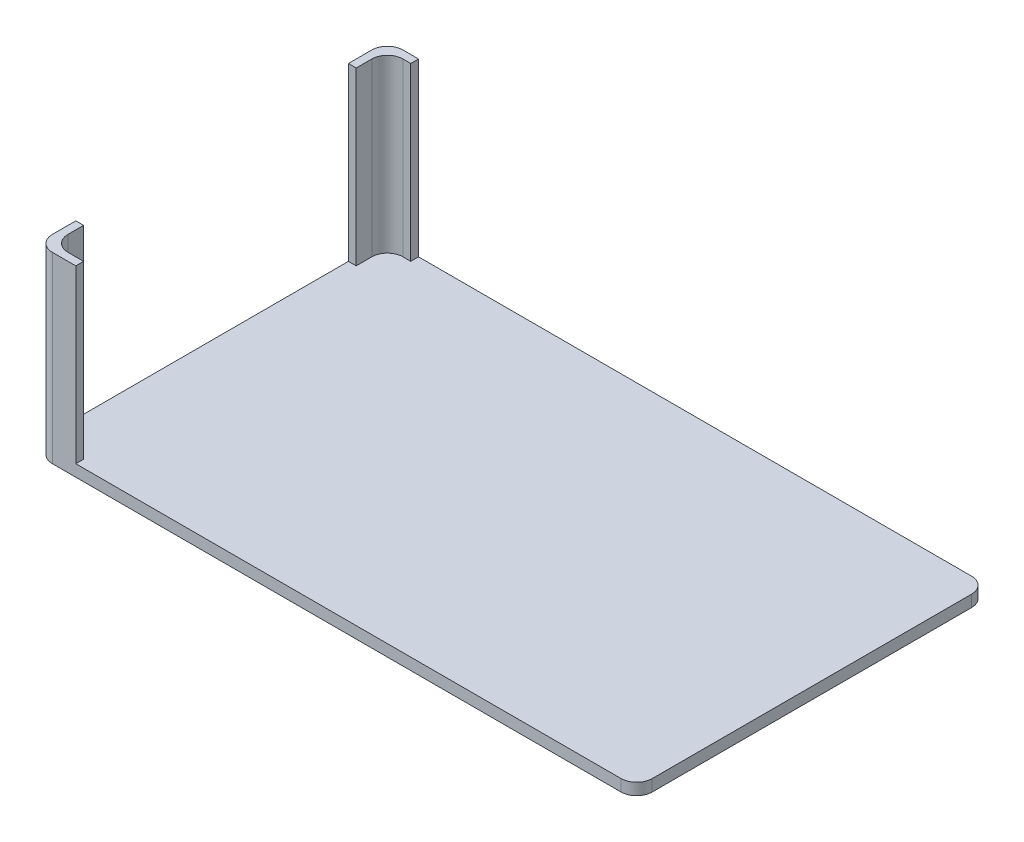
ISO-10303-21;
HEADER;
FILE_DESCRIPTION(('STEP AP214'),'2;1');
FILE_NAME('part.step','',(''),(''),'','','');
FILE_SCHEMA(('AUTOMOTIVE_DESIGN { 1 0 10303 214 1 1 1 1 }'));
ENDSEC;
DATA;
#1=APPLICATION_CONTEXT('core data for automotive mechanical design processes');
#2=APPLICATION_PROTOCOL_DEFINITION('international standard','automotive_design',2000,#1);
#3=PRODUCT_CONTEXT('',#1,'mechanical');
#4=PRODUCT('Part','Part','',(#3));
#5=PRODUCT_RELATED_PRODUCT_CATEGORY('part','',(#4));
#6=PRODUCT_DEFINITION_FORMATION('','',#4);
#7=PRODUCT_DEFINITION_CONTEXT('part definition',#1,'design');
#8=PRODUCT_DEFINITION('design','',#6,#7);
#9=PRODUCT_DEFINITION_SHAPE('','',#8);
#10=(LENGTH_UNIT() NAMED_UNIT(*) SI_UNIT(.MILLI.,.METRE.));
#11=(NAMED_UNIT(*) PLANE_ANGLE_UNIT() SI_UNIT($,.RADIAN.));
#12=(NAMED_UNIT(*) SI_UNIT($,.STERADIAN.) SOLID_ANGLE_UNIT());
#13=UNCERTAINTY_MEASURE_WITH_UNIT(LENGTH_MEASURE(1.E-05),#10,'distance_accuracy_value','');
#14=(GEOMETRIC_REPRESENTATION_CONTEXT(3) GLOBAL_UNCERTAINTY_ASSIGNED_CONTEXT((#13)) GLOBAL_UNIT_ASSIGNED_CONTEXT((#10,
#11,#12)) REPRESENTATION_CONTEXT('',''));
#15=CARTESIAN_POINT('',(0.,0.,0.));
#16=DIRECTION('',(0.,0.,1.));
#17=DIRECTION('',(1.,0.,0.));
#18=AXIS2_PLACEMENT_3D('',#15,#16,#17);
#19=CARTESIAN_POINT('',(-36.,23.5,29.));
#20=DIRECTION('',(0.,0.,-1.));
#21=DIRECTION('',(-1.,0.,0.));
#22=AXIS2_PLACEMENT_3D('',#19,#20,#21);
#23=PLANE('',#22);
#24=DIRECTION('',(0.,-1.,0.));
#25=VECTOR('',#24,1.);
#26=CARTESIAN_POINT('',(37.,23.5,29.));
#27=LINE('',#26,#25);
#28=CARTESIAN_POINT('',(37.,1.5,29.));
#29=VERTEX_POINT('',#28);
#30=CARTESIAN_POINT('',(37.,0.,29.));
#31=VERTEX_POINT('',#30);
#32=EDGE_CURVE('E245',#29,#31,#27,.T.);
#33=ORIENTED_EDGE('',*,*,#32,.F.);
#34=DIRECTION('',(1.,0.,0.));
#35=VECTOR('',#34,1.);
#36=CARTESIAN_POINT('',(0.,1.5,29.));
#37=LINE('',#36,#35);
#38=CARTESIAN_POINT('',(-33.,1.5,29.));
#39=VERTEX_POINT('',#38);
#40=EDGE_CURVE('E376',#39,#29,#37,.T.);
#41=ORIENTED_EDGE('',*,*,#40,.F.);
#42=DIRECTION('',(0.,1.,0.));
#43=VECTOR('',#42,1.);
#44=CARTESIAN_POINT('',(-33.,1.5,29.));
#45=LINE('',#44,#43);
#46=CARTESIAN_POINT('',(-33.,23.5,29.));
#47=VERTEX_POINT('',#46);
#48=EDGE_CURVE('E375',#39,#47,#45,.T.);
#49=ORIENTED_EDGE('',*,*,#48,.T.);
#50=DIRECTION('',(1.,0.,0.));
#51=VECTOR('',#50,1.);
#52=CARTESIAN_POINT('',(-36.,23.5,29.));
#53=LINE('',#52,#51);
#54=CARTESIAN_POINT('',(-36.,23.5,29.));
#55=VERTEX_POINT('',#54);
#56=EDGE_CURVE('E363',#55,#47,#53,.T.);
#57=ORIENTED_EDGE('',*,*,#56,.F.);
#58=DIRECTION('',(0.,-1.,0.));
#59=VECTOR('',#58,1.);
#60=CARTESIAN_POINT('',(-36.,23.5,29.));
#61=LINE('',#60,#59);
#62=CARTESIAN_POINT('',(-36.,0.,29.));
#63=VERTEX_POINT('',#62);
#64=EDGE_CURVE('E292',#55,#63,#61,.T.);
#65=ORIENTED_EDGE('',*,*,#64,.T.);
#66=DIRECTION('',(1.,0.,0.));
#67=VECTOR('',#66,1.);
#68=CARTESIAN_POINT('',(-36.,0.,29.));
#69=LINE('',#68,#67);
#70=EDGE_CURVE('E279',#63,#31,#69,.T.);
#71=ORIENTED_EDGE('',*,*,#70,.T.);
#72=EDGE_LOOP('',(#33,#41,#49,#57,#65,#71));
#73=FACE_BOUND('',#72,.T.);
#74=ADVANCED_FACE('F83',(#73),#23,.F.);
#75=CARTESIAN_POINT('',(39.,23.5,-14.));
#76=DIRECTION('',(1.,0.,0.));
#77=DIRECTION('',(0.,0.,-1.));
#78=AXIS2_PLACEMENT_3D('',#75,#76,#77);
#79=PLANE('',#78);
#80=DIRECTION('',(0.,-1.,0.));
#81=VECTOR('',#80,1.);
#82=CARTESIAN_POINT('',(39.,23.5,-14.));
#83=LINE('',#82,#81);
#84=CARTESIAN_POINT('',(39.,1.5,-14.));
#85=VERTEX_POINT('',#84);
#86=CARTESIAN_POINT('',(39.,0.,-14.));
#87=VERTEX_POINT('',#86);
#88=EDGE_CURVE('E234',#85,#87,#83,.T.);
#89=ORIENTED_EDGE('',*,*,#88,.F.);
#90=DIRECTION('',(0.,0.,-1.));
#91=VECTOR('',#90,1.);
#92=CARTESIAN_POINT('',(39.,1.5,0.));
#93=LINE('',#92,#91);
#94=CARTESIAN_POINT('',(39.,1.5,27.));
#95=VERTEX_POINT('',#94);
#96=EDGE_CURVE('E218',#95,#85,#93,.T.);
#97=ORIENTED_EDGE('',*,*,#96,.F.);
#98=DIRECTION('',(0.,-1.,0.));
#99=VECTOR('',#98,1.);
#100=CARTESIAN_POINT('',(39.,23.5,27.));
#101=LINE('',#100,#99);
#102=CARTESIAN_POINT('',(39.,0.,27.));
#103=VERTEX_POINT('',#102);
#104=EDGE_CURVE('E243',#95,#103,#101,.T.);
#105=ORIENTED_EDGE('',*,*,#104,.T.);
#106=DIRECTION('',(0.,0.,1.));
#107=VECTOR('',#106,1.);
#108=CARTESIAN_POINT('',(39.,0.,-14.));
#109=LINE('',#108,#107);
#110=EDGE_CURVE('E241',#87,#103,#109,.T.);
#111=ORIENTED_EDGE('',*,*,#110,.F.);
#112=EDGE_LOOP('',(#89,#97,#105,#111));
#113=FACE_BOUND('',#112,.T.);
#114=ADVANCED_FACE('F239',(#113),#79,.T.);
#115=CARTESIAN_POINT('',(-36.,23.5,-16.));
#116=DIRECTION('',(0.,0.,-1.));
#117=DIRECTION('',(-1.,0.,0.));
#118=AXIS2_PLACEMENT_3D('',#115,#116,#117);
#119=PLANE('',#118);
#120=DIRECTION('',(-1.,0.,0.));
#121=VECTOR('',#120,1.);
#122=CARTESIAN_POINT('',(0.,1.5,-16.));
#123=LINE('',#122,#121);
#124=CARTESIAN_POINT('',(37.,1.5,-16.));
#125=VERTEX_POINT('',#124);
#126=CARTESIAN_POINT('',(-34.,1.5,-16.));
#127=VERTEX_POINT('',#126);
#128=EDGE_CURVE('E312',#125,#127,#123,.T.);
#129=ORIENTED_EDGE('',*,*,#128,.F.);
#130=DIRECTION('',(0.,-1.,0.));
#131=VECTOR('',#130,1.);
#132=CARTESIAN_POINT('',(37.,23.5,-16.));
#133=LINE('',#132,#131);
#134=CARTESIAN_POINT('',(37.,0.,-16.));
#135=VERTEX_POINT('',#134);
#136=EDGE_CURVE('E236',#125,#135,#133,.T.);
#137=ORIENTED_EDGE('',*,*,#136,.T.);
#138=DIRECTION('',(1.,0.,0.));
#139=VECTOR('',#138,1.);
#140=CARTESIAN_POINT('',(-36.,0.,-16.));
#141=LINE('',#140,#139);
#142=CARTESIAN_POINT('',(-36.,0.,-16.));
#143=VERTEX_POINT('',#142);
#144=EDGE_CURVE('E269',#143,#135,#141,.T.);
#145=ORIENTED_EDGE('',*,*,#144,.F.);
#146=DIRECTION('',(0.,-1.,0.));
#147=VECTOR('',#146,1.);
#148=CARTESIAN_POINT('',(-36.,23.5,-16.));
#149=LINE('',#148,#147);
#150=CARTESIAN_POINT('',(-36.,23.5,-16.));
#151=VERTEX_POINT('',#150);
#152=EDGE_CURVE('E247',#151,#143,#149,.T.);
#153=ORIENTED_EDGE('',*,*,#152,.F.);
#154=DIRECTION('',(1.,0.,0.));
#155=VECTOR('',#154,1.);
#156=CARTESIAN_POINT('',(-36.,23.5,-16.));
#157=LINE('',#156,#155);
#158=CARTESIAN_POINT('',(-34.,23.5,-16.));
#159=VERTEX_POINT('',#158);
#160=EDGE_CURVE('E362',#151,#159,#157,.T.);
#161=ORIENTED_EDGE('',*,*,#160,.T.);
#162=DIRECTION('',(0.,1.,0.));
#163=VECTOR('',#162,1.);
#164=CARTESIAN_POINT('',(-34.,1.5,-16.));
#165=LINE('',#164,#163);
#166=EDGE_CURVE('E313',#127,#159,#165,.T.);
#167=ORIENTED_EDGE('',*,*,#166,.F.);
#168=EDGE_LOOP('',(#129,#137,#145,#153,#161,#167));
#169=FACE_BOUND('',#168,.T.);
#170=ADVANCED_FACE('F308',(#169),#119,.T.);
#171=CARTESIAN_POINT('',(37.,23.5,27.));
#172=DIRECTION('',(0.,-1.,0.));
#173=DIRECTION('',(0.,0.,-1.));
#174=AXIS2_PLACEMENT_3D('',#171,#172,#173);
#175=CYLINDRICAL_SURFACE('',#174,2.);
#176=ORIENTED_EDGE('',*,*,#104,.F.);
#177=CARTESIAN_POINT('',(37.,1.5,27.));
#178=DIRECTION('',(0.,1.,0.));
#179=DIRECTION('',(0.,0.,1.));
#180=AXIS2_PLACEMENT_3D('',#177,#178,#179);
#181=CIRCLE('',#180,2.);
#182=EDGE_CURVE('E224',#29,#95,#181,.T.);
#183=ORIENTED_EDGE('',*,*,#182,.F.);
#184=ORIENTED_EDGE('',*,*,#32,.T.);
#185=CARTESIAN_POINT('',(37.,0.,27.));
#186=DIRECTION('',(0.,-1.,0.));
#187=DIRECTION('',(0.,0.,-1.));
#188=AXIS2_PLACEMENT_3D('',#185,#186,#187);
#189=CIRCLE('',#188,2.);
#190=EDGE_CURVE('E276',#103,#31,#189,.T.);
#191=ORIENTED_EDGE('',*,*,#190,.F.);
#192=EDGE_LOOP('',(#176,#183,#184,#191));
#193=FACE_BOUND('',#192,.T.);
#194=ADVANCED_FACE('F297',(#193),#175,.T.);
#195=CARTESIAN_POINT('',(37.,23.5,-14.));
#196=DIRECTION('',(0.,-1.,0.));
#197=DIRECTION('',(0.,0.,-1.));
#198=AXIS2_PLACEMENT_3D('',#195,#196,#197);
#199=CYLINDRICAL_SURFACE('',#198,2.);
#200=ORIENTED_EDGE('',*,*,#136,.F.);
#201=CARTESIAN_POINT('',(37.,1.5,-14.));
#202=DIRECTION('',(0.,1.,0.));
#203=DIRECTION('',(0.,0.,1.));
#204=AXIS2_PLACEMENT_3D('',#201,#202,#203);
#205=CIRCLE('',#204,2.);
#206=EDGE_CURVE('E221',#85,#125,#205,.T.);
#207=ORIENTED_EDGE('',*,*,#206,.F.);
#208=ORIENTED_EDGE('',*,*,#88,.T.);
#209=CARTESIAN_POINT('',(37.,0.,-14.));
#210=DIRECTION('',(0.,-1.,0.));
#211=DIRECTION('',(0.,0.,-1.));
#212=AXIS2_PLACEMENT_3D('',#209,#210,#211);
#213=CIRCLE('',#212,2.);
#214=EDGE_CURVE('E273',#135,#87,#213,.T.);
#215=ORIENTED_EDGE('',*,*,#214,.F.);
#216=EDGE_LOOP('',(#200,#207,#208,#215));
#217=FACE_BOUND('',#216,.T.);
#218=ADVANCED_FACE('F232',(#217),#199,.T.);
#219=CARTESIAN_POINT('',(-36.,23.5,-14.));
#220=DIRECTION('',(0.,-1.,0.));
#221=DIRECTION('',(0.,0.,-1.));
#222=AXIS2_PLACEMENT_3D('',#219,#220,#221);
#223=PLANE('',#222);
#224=DIRECTION('',(1.,0.,0.));
#225=VECTOR('',#224,1.);
#226=CARTESIAN_POINT('',(0.,23.5,-11.));
#227=LINE('',#226,#225);
#228=CARTESIAN_POINT('',(-38.,23.5,-11.));
#229=VERTEX_POINT('',#228);
#230=CARTESIAN_POINT('',(-37.,23.5,-11.));
#231=VERTEX_POINT('',#230);
#232=EDGE_CURVE('E379',#229,#231,#227,.T.);
#233=ORIENTED_EDGE('',*,*,#232,.T.);
#234=DIRECTION('',(0.,0.,-1.));
#235=VECTOR('',#234,1.);
#236=CARTESIAN_POINT('',(-37.,23.5,26.));
#237=LINE('',#236,#235);
#238=CARTESIAN_POINT('',(-37.,23.5,-13.));
#239=VERTEX_POINT('',#238);
#240=EDGE_CURVE('E346',#231,#239,#237,.T.);
#241=ORIENTED_EDGE('',*,*,#240,.T.);
#242=CARTESIAN_POINT('',(-35.,23.5,-13.));
#243=DIRECTION('',(0.,1.,0.));
#244=DIRECTION('',(0.,0.,1.));
#245=AXIS2_PLACEMENT_3D('',#242,#243,#244);
#246=CIRCLE('',#245,2.);
#247=CARTESIAN_POINT('',(-35.,23.5,-15.));
#248=VERTEX_POINT('',#247);
#249=EDGE_CURVE('E343',#248,#239,#246,.T.);
#250=ORIENTED_EDGE('',*,*,#249,.F.);
#251=DIRECTION('',(1.,0.,0.));
#252=VECTOR('',#251,1.);
#253=CARTESIAN_POINT('',(-35.,23.5,-15.));
#254=LINE('',#253,#252);
#255=CARTESIAN_POINT('',(-34.,23.5,-15.));
#256=VERTEX_POINT('',#255);
#257=EDGE_CURVE('E340',#248,#256,#254,.T.);
#258=ORIENTED_EDGE('',*,*,#257,.T.);
#259=DIRECTION('',(0.,0.,-1.));
#260=VECTOR('',#259,1.);
#261=CARTESIAN_POINT('',(-34.,23.5,0.));
#262=LINE('',#261,#260);
#263=EDGE_CURVE('E237',#256,#159,#262,.T.);
#264=ORIENTED_EDGE('',*,*,#263,.T.);
#265=ORIENTED_EDGE('',*,*,#160,.F.);
#266=CARTESIAN_POINT('',(-36.,23.5,-14.));
#267=DIRECTION('',(0.,-1.,0.));
#268=DIRECTION('',(0.,0.,-1.));
#269=AXIS2_PLACEMENT_3D('',#266,#267,#268);
#270=CIRCLE('',#269,2.);
#271=CARTESIAN_POINT('',(-38.,23.5,-14.));
#272=VERTEX_POINT('',#271);
#273=EDGE_CURVE('E286',#272,#151,#270,.T.);
#274=ORIENTED_EDGE('',*,*,#273,.F.);
#275=DIRECTION('',(0.,0.,1.));
#276=VECTOR('',#275,1.);
#277=CARTESIAN_POINT('',(-38.,23.5,-14.));
#278=LINE('',#277,#276);
#279=EDGE_CURVE('E250',#272,#229,#278,.T.);
#280=ORIENTED_EDGE('',*,*,#279,.T.);
#281=EDGE_LOOP('',(#233,#241,#250,#258,#264,#265,#274,#280));
#282=FACE_BOUND('',#281,.T.);
#283=ADVANCED_FACE('F419',(#282),#223,.F.);
#284=CARTESIAN_POINT('',(-37.,23.5,26.));
#285=VERTEX_POINT('',#284);
#286=CARTESIAN_POINT('',(-37.,23.5,24.));
#287=VERTEX_POINT('',#286);
#288=EDGE_CURVE('E347',#285,#287,#237,.T.);
#289=ORIENTED_EDGE('',*,*,#288,.T.);
#290=DIRECTION('',(1.,0.,0.));
#291=VECTOR('',#290,1.);
#292=CARTESIAN_POINT('',(0.,23.5,24.));
#293=LINE('',#292,#291);
#294=CARTESIAN_POINT('',(-38.,23.5,24.));
#295=VERTEX_POINT('',#294);
#296=EDGE_CURVE('E382',#295,#287,#293,.T.);
#297=ORIENTED_EDGE('',*,*,#296,.F.);
#298=CARTESIAN_POINT('',(-38.,23.5,27.));
#299=VERTEX_POINT('',#298);
#300=EDGE_CURVE('E256',#295,#299,#278,.T.);
#301=ORIENTED_EDGE('',*,*,#300,.T.);
#302=CARTESIAN_POINT('',(-36.,23.5,27.));
#303=DIRECTION('',(0.,1.,0.));
#304=DIRECTION('',(0.,0.,1.));
#305=AXIS2_PLACEMENT_3D('',#302,#303,#304);
#306=CIRCLE('',#305,2.);
#307=EDGE_CURVE('E262',#299,#55,#306,.T.);
#308=ORIENTED_EDGE('',*,*,#307,.T.);
#309=ORIENTED_EDGE('',*,*,#56,.T.);
#310=DIRECTION('',(0.,0.,-1.));
#311=VECTOR('',#310,1.);
#312=CARTESIAN_POINT('',(-33.,23.5,0.));
#313=LINE('',#312,#311);
#314=CARTESIAN_POINT('',(-33.,23.5,28.));
#315=VERTEX_POINT('',#314);
#316=EDGE_CURVE('E323',#47,#315,#313,.T.);
#317=ORIENTED_EDGE('',*,*,#316,.T.);
#318=DIRECTION('',(1.,0.,0.));
#319=VECTOR('',#318,1.);
#320=CARTESIAN_POINT('',(-35.,23.5,28.));
#321=LINE('',#320,#319);
#322=CARTESIAN_POINT('',(-35.,23.5,28.));
#323=VERTEX_POINT('',#322);
#324=EDGE_CURVE('E337',#323,#315,#321,.T.);
#325=ORIENTED_EDGE('',*,*,#324,.F.);
#326=CARTESIAN_POINT('',(-35.,23.5,26.));
#327=DIRECTION('',(0.,1.,0.));
#328=DIRECTION('',(0.,0.,1.));
#329=AXIS2_PLACEMENT_3D('',#326,#327,#328);
#330=CIRCLE('',#329,2.);
#331=EDGE_CURVE('E335',#285,#323,#330,.T.);
#332=ORIENTED_EDGE('',*,*,#331,.F.);
#333=EDGE_LOOP('',(#289,#297,#301,#308,#309,#317,#325,#332));
#334=FACE_BOUND('',#333,.T.);
#335=ADVANCED_FACE('F368',(#334),#223,.F.);
#336=CARTESIAN_POINT('',(-38.,23.5,-14.));
#337=DIRECTION('',(1.,0.,0.));
#338=DIRECTION('',(0.,0.,-1.));
#339=AXIS2_PLACEMENT_3D('',#336,#337,#338);
#340=PLANE('',#339);
#341=DIRECTION('',(0.,1.,0.));
#342=VECTOR('',#341,1.);
#343=CARTESIAN_POINT('',(-38.,1.5,-11.));
#344=LINE('',#343,#342);
#345=CARTESIAN_POINT('',(-38.,1.5,-11.));
#346=VERTEX_POINT('',#345);
#347=EDGE_CURVE('E389',#346,#229,#344,.T.);
#348=ORIENTED_EDGE('',*,*,#347,.T.);
#349=ORIENTED_EDGE('',*,*,#279,.F.);
#350=DIRECTION('',(0.,-1.,0.));
#351=VECTOR('',#350,1.);
#352=CARTESIAN_POINT('',(-38.,23.5,-14.));
#353=LINE('',#352,#351);
#354=CARTESIAN_POINT('',(-38.,0.,-14.));
#355=VERTEX_POINT('',#354);
#356=EDGE_CURVE('E287',#272,#355,#353,.T.);
#357=ORIENTED_EDGE('',*,*,#356,.T.);
#358=DIRECTION('',(0.,0.,1.));
#359=VECTOR('',#358,1.);
#360=CARTESIAN_POINT('',(-38.,0.,-14.));
#361=LINE('',#360,#359);
#362=CARTESIAN_POINT('',(-38.,0.,27.));
#363=VERTEX_POINT('',#362);
#364=EDGE_CURVE('E284',#355,#363,#361,.T.);
#365=ORIENTED_EDGE('',*,*,#364,.T.);
#366=DIRECTION('',(0.,-1.,0.));
#367=VECTOR('',#366,1.);
#368=CARTESIAN_POINT('',(-38.,23.5,27.));
#369=LINE('',#368,#367);
#370=EDGE_CURVE('E289',#299,#363,#369,.T.);
#371=ORIENTED_EDGE('',*,*,#370,.F.);
#372=ORIENTED_EDGE('',*,*,#300,.F.);
#373=DIRECTION('',(0.,1.,0.));
#374=VECTOR('',#373,1.);
#375=CARTESIAN_POINT('',(-38.,1.5,24.));
#376=LINE('',#375,#374);
#377=CARTESIAN_POINT('',(-38.,1.5,24.));
#378=VERTEX_POINT('',#377);
#379=EDGE_CURVE('E392',#378,#295,#376,.T.);
#380=ORIENTED_EDGE('',*,*,#379,.F.);
#381=DIRECTION('',(0.,0.,1.));
#382=VECTOR('',#381,1.);
#383=CARTESIAN_POINT('',(-38.,1.5,0.));
#384=LINE('',#383,#382);
#385=EDGE_CURVE('E401',#346,#378,#384,.T.);
#386=ORIENTED_EDGE('',*,*,#385,.F.);
#387=EDGE_LOOP('',(#348,#349,#357,#365,#371,#372,#380,#386));
#388=FACE_BOUND('',#387,.T.);
#389=ADVANCED_FACE('F421',(#388),#340,.F.);
#390=CARTESIAN_POINT('',(-35.,23.5,28.));
#391=DIRECTION('',(0.,0.,-1.));
#392=DIRECTION('',(-1.,0.,0.));
#393=AXIS2_PLACEMENT_3D('',#390,#391,#392);
#394=PLANE('',#393);
#395=ORIENTED_EDGE('',*,*,#324,.T.);
#396=DIRECTION('',(0.,1.,0.));
#397=VECTOR('',#396,1.);
#398=CARTESIAN_POINT('',(-33.,1.5,28.));
#399=LINE('',#398,#397);
#400=CARTESIAN_POINT('',(-33.,1.5,28.));
#401=VERTEX_POINT('',#400);
#402=EDGE_CURVE('E380',#401,#315,#399,.T.);
#403=ORIENTED_EDGE('',*,*,#402,.F.);
#404=DIRECTION('',(1.,0.,0.));
#405=VECTOR('',#404,1.);
#406=CARTESIAN_POINT('',(0.,1.5,28.));
#407=LINE('',#406,#405);
#408=CARTESIAN_POINT('',(-35.,1.5,28.));
#409=VERTEX_POINT('',#408);
#410=EDGE_CURVE('E326',#409,#401,#407,.T.);
#411=ORIENTED_EDGE('',*,*,#410,.F.);
#412=DIRECTION('',(0.,-1.,0.));
#413=VECTOR('',#412,1.);
#414=CARTESIAN_POINT('',(-35.,23.5,28.));
#415=LINE('',#414,#413);
#416=EDGE_CURVE('E270',#323,#409,#415,.T.);
#417=ORIENTED_EDGE('',*,*,#416,.F.);
#418=EDGE_LOOP('',(#395,#403,#411,#417));
#419=FACE_BOUND('',#418,.T.);
#420=ADVANCED_FACE('F436',(#419),#394,.T.);
#421=CARTESIAN_POINT('',(-35.,23.5,-15.));
#422=DIRECTION('',(0.,0.,-1.));
#423=DIRECTION('',(-1.,0.,0.));
#424=AXIS2_PLACEMENT_3D('',#421,#422,#423);
#425=PLANE('',#424);
#426=DIRECTION('',(0.,1.,0.));
#427=VECTOR('',#426,1.);
#428=CARTESIAN_POINT('',(-34.,1.5,-15.));
#429=LINE('',#428,#427);
#430=CARTESIAN_POINT('',(-34.,1.5,-15.));
#431=VERTEX_POINT('',#430);
#432=EDGE_CURVE('E314',#431,#256,#429,.T.);
#433=ORIENTED_EDGE('',*,*,#432,.T.);
#434=ORIENTED_EDGE('',*,*,#257,.F.);
#435=DIRECTION('',(0.,-1.,0.));
#436=VECTOR('',#435,1.);
#437=CARTESIAN_POINT('',(-35.,23.5,-15.));
#438=LINE('',#437,#436);
#439=CARTESIAN_POINT('',(-35.,1.5,-15.));
#440=VERTEX_POINT('',#439);
#441=EDGE_CURVE('E356',#248,#440,#438,.T.);
#442=ORIENTED_EDGE('',*,*,#441,.T.);
#443=DIRECTION('',(1.,0.,0.));
#444=VECTOR('',#443,1.);
#445=CARTESIAN_POINT('',(-35.,1.5,-15.));
#446=LINE('',#445,#444);
#447=EDGE_CURVE('E332',#440,#431,#446,.T.);
#448=ORIENTED_EDGE('',*,*,#447,.T.);
#449=EDGE_LOOP('',(#433,#434,#442,#448));
#450=FACE_BOUND('',#449,.T.);
#451=ADVANCED_FACE('F498',(#450),#425,.F.);
#452=CARTESIAN_POINT('',(-37.,23.5,26.));
#453=DIRECTION('',(-1.,0.,0.));
#454=DIRECTION('',(0.,0.,1.));
#455=AXIS2_PLACEMENT_3D('',#452,#453,#454);
#456=PLANE('',#455);
#457=DIRECTION('',(0.,1.,0.));
#458=VECTOR('',#457,1.);
#459=CARTESIAN_POINT('',(-37.,1.5,-11.));
#460=LINE('',#459,#458);
#461=CARTESIAN_POINT('',(-37.,1.5,-11.));
#462=VERTEX_POINT('',#461);
#463=EDGE_CURVE('E229',#462,#231,#460,.T.);
#464=ORIENTED_EDGE('',*,*,#463,.F.);
#465=DIRECTION('',(0.,0.,-1.));
#466=VECTOR('',#465,1.);
#467=CARTESIAN_POINT('',(-37.,1.5,26.));
#468=LINE('',#467,#466);
#469=CARTESIAN_POINT('',(-37.,1.5,-13.));
#470=VERTEX_POINT('',#469);
#471=EDGE_CURVE('E91',#462,#470,#468,.T.);
#472=ORIENTED_EDGE('',*,*,#471,.T.);
#473=DIRECTION('',(0.,-1.,0.));
#474=VECTOR('',#473,1.);
#475=CARTESIAN_POINT('',(-37.,23.5,-13.));
#476=LINE('',#475,#474);
#477=EDGE_CURVE('E353',#239,#470,#476,.T.);
#478=ORIENTED_EDGE('',*,*,#477,.F.);
#479=ORIENTED_EDGE('',*,*,#240,.F.);
#480=EDGE_LOOP('',(#464,#472,#478,#479));
#481=FACE_BOUND('',#480,.T.);
#482=ADVANCED_FACE('F412',(#481),#456,.F.);
#483=CARTESIAN_POINT('',(-36.,0.,-14.));
#484=DIRECTION('',(0.,-1.,0.));
#485=DIRECTION('',(0.,0.,-1.));
#486=AXIS2_PLACEMENT_3D('',#483,#484,#485);
#487=PLANE('',#486);
#488=ORIENTED_EDGE('',*,*,#110,.T.);
#489=ORIENTED_EDGE('',*,*,#190,.T.);
#490=ORIENTED_EDGE('',*,*,#70,.F.);
#491=CARTESIAN_POINT('',(-36.,0.,27.));
#492=DIRECTION('',(0.,1.,0.));
#493=DIRECTION('',(0.,0.,1.));
#494=AXIS2_PLACEMENT_3D('',#491,#492,#493);
#495=CIRCLE('',#494,2.);
#496=EDGE_CURVE('E282',#363,#63,#495,.T.);
#497=ORIENTED_EDGE('',*,*,#496,.F.);
#498=ORIENTED_EDGE('',*,*,#364,.F.);
#499=CARTESIAN_POINT('',(-36.,0.,-14.));
#500=DIRECTION('',(0.,-1.,0.));
#501=DIRECTION('',(0.,0.,-1.));
#502=AXIS2_PLACEMENT_3D('',#499,#500,#501);
#503=CIRCLE('',#502,2.);
#504=EDGE_CURVE('E266',#355,#143,#503,.T.);
#505=ORIENTED_EDGE('',*,*,#504,.T.);
#506=ORIENTED_EDGE('',*,*,#144,.T.);
#507=ORIENTED_EDGE('',*,*,#214,.T.);
#508=EDGE_LOOP('',(#488,#489,#490,#497,#498,#505,#506,#507));
#509=FACE_BOUND('',#508,.T.);
#510=ADVANCED_FACE('F305',(#509),#487,.T.);
#511=CARTESIAN_POINT('',(-36.,23.5,-14.));
#512=DIRECTION('',(0.,-1.,0.));
#513=DIRECTION('',(0.,0.,-1.));
#514=AXIS2_PLACEMENT_3D('',#511,#512,#513);
#515=CYLINDRICAL_SURFACE('',#514,2.);
#516=ORIENTED_EDGE('',*,*,#504,.F.);
#517=ORIENTED_EDGE('',*,*,#356,.F.);
#518=ORIENTED_EDGE('',*,*,#273,.T.);
#519=ORIENTED_EDGE('',*,*,#152,.T.);
#520=EDGE_LOOP('',(#516,#517,#518,#519));
#521=FACE_BOUND('',#520,.T.);
#522=ADVANCED_FACE('F85',(#521),#515,.T.);
#523=CARTESIAN_POINT('',(-36.,23.5,27.));
#524=DIRECTION('',(0.,-1.,0.));
#525=DIRECTION('',(0.,0.,-1.));
#526=AXIS2_PLACEMENT_3D('',#523,#524,#525);
#527=CYLINDRICAL_SURFACE('',#526,2.);
#528=ORIENTED_EDGE('',*,*,#496,.T.);
#529=ORIENTED_EDGE('',*,*,#64,.F.);
#530=ORIENTED_EDGE('',*,*,#307,.F.);
#531=ORIENTED_EDGE('',*,*,#370,.T.);
#532=EDGE_LOOP('',(#528,#529,#530,#531));
#533=FACE_BOUND('',#532,.T.);
#534=ADVANCED_FACE('F373',(#533),#527,.T.);
#535=CARTESIAN_POINT('',(-35.,23.5,26.));
#536=DIRECTION('',(0.,-1.,0.));
#537=DIRECTION('',(0.,0.,-1.));
#538=AXIS2_PLACEMENT_3D('',#535,#536,#537);
#539=CYLINDRICAL_SURFACE('',#538,2.);
#540=CARTESIAN_POINT('',(-35.,1.5,26.));
#541=DIRECTION('',(0.,1.,0.));
#542=DIRECTION('',(0.,0.,1.));
#543=AXIS2_PLACEMENT_3D('',#540,#541,#542);
#544=CIRCLE('',#543,2.);
#545=CARTESIAN_POINT('',(-37.,1.5,26.));
#546=VERTEX_POINT('',#545);
#547=EDGE_CURVE('E228',#546,#409,#544,.T.);
#548=ORIENTED_EDGE('',*,*,#547,.F.);
#549=DIRECTION('',(0.,-1.,0.));
#550=VECTOR('',#549,1.);
#551=CARTESIAN_POINT('',(-37.,23.5,26.));
#552=LINE('',#551,#550);
#553=EDGE_CURVE('E350',#285,#546,#552,.T.);
#554=ORIENTED_EDGE('',*,*,#553,.F.);
#555=ORIENTED_EDGE('',*,*,#331,.T.);
#556=ORIENTED_EDGE('',*,*,#416,.T.);
#557=EDGE_LOOP('',(#548,#554,#555,#556));
#558=FACE_BOUND('',#557,.T.);
#559=ADVANCED_FACE('F433',(#558),#539,.F.);
#560=CARTESIAN_POINT('',(-35.,23.5,-13.));
#561=DIRECTION('',(0.,-1.,0.));
#562=DIRECTION('',(0.,0.,-1.));
#563=AXIS2_PLACEMENT_3D('',#560,#561,#562);
#564=CYLINDRICAL_SURFACE('',#563,2.);
#565=CARTESIAN_POINT('',(-35.,1.5,-13.));
#566=DIRECTION('',(0.,1.,0.));
#567=DIRECTION('',(0.,0.,1.));
#568=AXIS2_PLACEMENT_3D('',#565,#566,#567);
#569=CIRCLE('',#568,2.);
#570=EDGE_CURVE('E329',#440,#470,#569,.T.);
#571=ORIENTED_EDGE('',*,*,#570,.F.);
#572=ORIENTED_EDGE('',*,*,#441,.F.);
#573=ORIENTED_EDGE('',*,*,#249,.T.);
#574=ORIENTED_EDGE('',*,*,#477,.T.);
#575=EDGE_LOOP('',(#571,#572,#573,#574));
#576=FACE_BOUND('',#575,.T.);
#577=ADVANCED_FACE('F416',(#576),#564,.F.);
#578=CARTESIAN_POINT('',(-37.,1.5,24.));
#579=VERTEX_POINT('',#578);
#580=EDGE_CURVE('E12',#546,#579,#468,.T.);
#581=ORIENTED_EDGE('',*,*,#580,.T.);
#582=DIRECTION('',(0.,1.,0.));
#583=VECTOR('',#582,1.);
#584=CARTESIAN_POINT('',(-37.,1.5,24.));
#585=LINE('',#584,#583);
#586=EDGE_CURVE('E394',#579,#287,#585,.T.);
#587=ORIENTED_EDGE('',*,*,#586,.T.);
#588=ORIENTED_EDGE('',*,*,#288,.F.);
#589=ORIENTED_EDGE('',*,*,#553,.T.);
#590=EDGE_LOOP('',(#581,#587,#588,#589));
#591=FACE_BOUND('',#590,.T.);
#592=ADVANCED_FACE('F429',(#591),#456,.F.);
#593=CARTESIAN_POINT('',(0.,1.5,0.));
#594=DIRECTION('',(0.,1.,0.));
#595=DIRECTION('',(0.,0.,1.));
#596=AXIS2_PLACEMENT_3D('',#593,#594,#595);
#597=PLANE('',#596);
#598=ORIENTED_EDGE('',*,*,#206,.T.);
#599=ORIENTED_EDGE('',*,*,#128,.T.);
#600=DIRECTION('',(0.,0.,-1.));
#601=VECTOR('',#600,1.);
#602=CARTESIAN_POINT('',(-34.,1.5,0.));
#603=LINE('',#602,#601);
#604=EDGE_CURVE('E105',#431,#127,#603,.T.);
#605=ORIENTED_EDGE('',*,*,#604,.F.);
#606=ORIENTED_EDGE('',*,*,#447,.F.);
#607=ORIENTED_EDGE('',*,*,#570,.T.);
#608=ORIENTED_EDGE('',*,*,#471,.F.);
#609=DIRECTION('',(1.,0.,0.));
#610=VECTOR('',#609,1.);
#611=CARTESIAN_POINT('',(0.,1.5,-11.));
#612=LINE('',#611,#610);
#613=EDGE_CURVE('E398',#346,#462,#612,.T.);
#614=ORIENTED_EDGE('',*,*,#613,.F.);
#615=ORIENTED_EDGE('',*,*,#385,.T.);
#616=DIRECTION('',(1.,0.,0.));
#617=VECTOR('',#616,1.);
#618=CARTESIAN_POINT('',(0.,1.5,24.));
#619=LINE('',#618,#617);
#620=EDGE_CURVE('E98',#378,#579,#619,.T.);
#621=ORIENTED_EDGE('',*,*,#620,.T.);
#622=ORIENTED_EDGE('',*,*,#580,.F.);
#623=ORIENTED_EDGE('',*,*,#547,.T.);
#624=ORIENTED_EDGE('',*,*,#410,.T.);
#625=DIRECTION('',(0.,0.,-1.));
#626=VECTOR('',#625,1.);
#627=CARTESIAN_POINT('',(-33.,1.5,0.));
#628=LINE('',#627,#626);
#629=EDGE_CURVE('E384',#39,#401,#628,.T.);
#630=ORIENTED_EDGE('',*,*,#629,.F.);
#631=ORIENTED_EDGE('',*,*,#40,.T.);
#632=ORIENTED_EDGE('',*,*,#182,.T.);
#633=ORIENTED_EDGE('',*,*,#96,.T.);
#634=EDGE_LOOP('',(#598,#599,#605,#606,#607,#608,#614,#615,#621,#622,#623,#624,#630,#631,#632,#633));
#635=FACE_BOUND('',#634,.T.);
#636=ADVANCED_FACE('F220',(#635),#597,.T.);
#637=CARTESIAN_POINT('',(-34.,1.5,0.));
#638=DIRECTION('',(1.,0.,0.));
#639=DIRECTION('',(0.,0.,-1.));
#640=AXIS2_PLACEMENT_3D('',#637,#638,#639);
#641=PLANE('',#640);
#642=ORIENTED_EDGE('',*,*,#263,.F.);
#643=ORIENTED_EDGE('',*,*,#432,.F.);
#644=ORIENTED_EDGE('',*,*,#604,.T.);
#645=ORIENTED_EDGE('',*,*,#166,.T.);
#646=EDGE_LOOP('',(#642,#643,#644,#645));
#647=FACE_BOUND('',#646,.T.);
#648=ADVANCED_FACE('F440',(#647),#641,.T.);
#649=CARTESIAN_POINT('',(-33.,1.5,0.));
#650=DIRECTION('',(1.,0.,0.));
#651=DIRECTION('',(0.,0.,-1.));
#652=AXIS2_PLACEMENT_3D('',#649,#650,#651);
#653=PLANE('',#652);
#654=ORIENTED_EDGE('',*,*,#316,.F.);
#655=ORIENTED_EDGE('',*,*,#48,.F.);
#656=ORIENTED_EDGE('',*,*,#629,.T.);
#657=ORIENTED_EDGE('',*,*,#402,.T.);
#658=EDGE_LOOP('',(#654,#655,#656,#657));
#659=FACE_BOUND('',#658,.T.);
#660=ADVANCED_FACE('F438',(#659),#653,.T.);
#661=CARTESIAN_POINT('',(0.,1.5,-11.));
#662=DIRECTION('',(0.,0.,1.));
#663=DIRECTION('',(1.,0.,0.));
#664=AXIS2_PLACEMENT_3D('',#661,#662,#663);
#665=PLANE('',#664);
#666=ORIENTED_EDGE('',*,*,#232,.F.);
#667=ORIENTED_EDGE('',*,*,#347,.F.);
#668=ORIENTED_EDGE('',*,*,#613,.T.);
#669=ORIENTED_EDGE('',*,*,#463,.T.);
#670=EDGE_LOOP('',(#666,#667,#668,#669));
#671=FACE_BOUND('',#670,.T.);
#672=ADVANCED_FACE('F407',(#671),#665,.T.);
#673=CARTESIAN_POINT('',(0.,1.5,24.));
#674=DIRECTION('',(0.,0.,1.));
#675=DIRECTION('',(1.,0.,0.));
#676=AXIS2_PLACEMENT_3D('',#673,#674,#675);
#677=PLANE('',#676);
#678=ORIENTED_EDGE('',*,*,#296,.T.);
#679=ORIENTED_EDGE('',*,*,#586,.F.);
#680=ORIENTED_EDGE('',*,*,#620,.F.);
#681=ORIENTED_EDGE('',*,*,#379,.T.);
#682=EDGE_LOOP('',(#678,#679,#680,#681));
#683=FACE_BOUND('',#682,.T.);
#684=ADVANCED_FACE('F424',(#683),#677,.F.);
#685=CLOSED_SHELL('',(#74,#114,#170,#194,#218,#283,#335,#389,#420,#451,#482,#510,#522,#534,#559,
#577,#592,#636,#648,#660,#672,#684));
#686=MANIFOLD_SOLID_BREP('B2',#685);
#687=ADVANCED_BREP_SHAPE_REPRESENTATION('',(#18,#686),#14);
#688=SHAPE_DEFINITION_REPRESENTATION(#9,#687);
ENDSEC;
END-ISO-10303-21;
